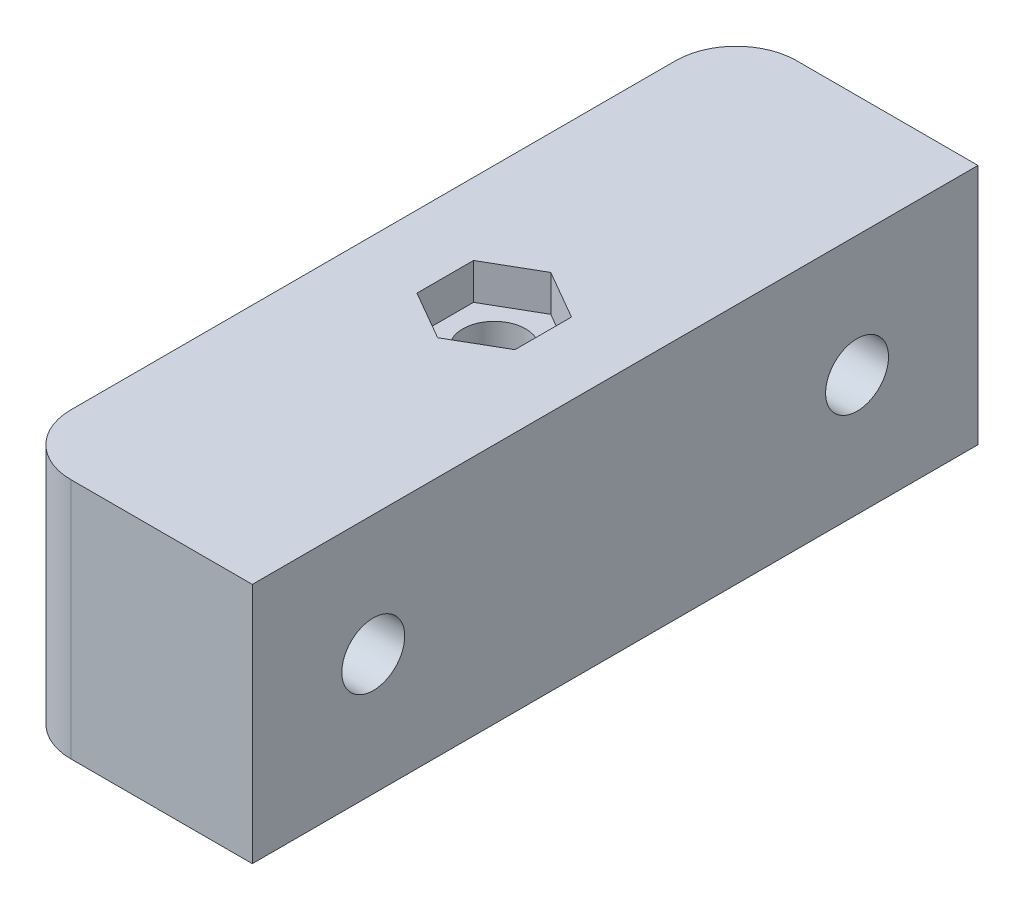
ISO-10303-21;
HEADER;
FILE_DESCRIPTION(('STEP AP214'),'2;1');
FILE_NAME('part.step','',(''),(''),'','','');
FILE_SCHEMA(('AUTOMOTIVE_DESIGN { 1 0 10303 214 1 1 1 1 }'));
ENDSEC;
DATA;
#1=APPLICATION_CONTEXT('core data for automotive mechanical design processes');
#2=APPLICATION_PROTOCOL_DEFINITION('international standard','automotive_design',2000,#1);
#3=PRODUCT_CONTEXT('',#1,'mechanical');
#4=PRODUCT('Part','Part','',(#3));
#5=PRODUCT_RELATED_PRODUCT_CATEGORY('part','',(#4));
#6=PRODUCT_DEFINITION_FORMATION('','',#4);
#7=PRODUCT_DEFINITION_CONTEXT('part definition',#1,'design');
#8=PRODUCT_DEFINITION('design','',#6,#7);
#9=PRODUCT_DEFINITION_SHAPE('','',#8);
#10=(LENGTH_UNIT() NAMED_UNIT(*) SI_UNIT(.MILLI.,.METRE.));
#11=(NAMED_UNIT(*) PLANE_ANGLE_UNIT() SI_UNIT($,.RADIAN.));
#12=(NAMED_UNIT(*) SI_UNIT($,.STERADIAN.) SOLID_ANGLE_UNIT());
#13=UNCERTAINTY_MEASURE_WITH_UNIT(LENGTH_MEASURE(1.E-05),#10,'distance_accuracy_value','');
#14=(GEOMETRIC_REPRESENTATION_CONTEXT(3) GLOBAL_UNCERTAINTY_ASSIGNED_CONTEXT((#13)) GLOBAL_UNIT_ASSIGNED_CONTEXT((#10,
#11,#12)) REPRESENTATION_CONTEXT('',''));
#15=CARTESIAN_POINT('',(0.,0.,0.));
#16=DIRECTION('',(0.,0.,1.));
#17=DIRECTION('',(1.,0.,0.));
#18=AXIS2_PLACEMENT_3D('',#15,#16,#17);
#19=CARTESIAN_POINT('',(-10.,0.,0.));
#20=DIRECTION('',(0.,1.,0.));
#21=DIRECTION('',(0.,0.,1.));
#22=AXIS2_PLACEMENT_3D('',#19,#20,#21);
#23=CYLINDRICAL_SURFACE('',#22,2.6);
#24=CARTESIAN_POINT('',(-10.,17.,0.));
#25=DIRECTION('',(0.,1.,0.));
#26=DIRECTION('',(0.,0.,1.));
#27=AXIS2_PLACEMENT_3D('',#24,#25,#26);
#28=CIRCLE('',#27,2.6);
#29=CARTESIAN_POINT('',(-10.,17.,2.6));
#30=VERTEX_POINT('',#29);
#31=EDGE_CURVE('E263',#30,#30,#28,.F.);
#32=ORIENTED_EDGE('',*,*,#31,.F.);
#33=EDGE_LOOP('',(#32));
#34=FACE_BOUND('',#33,.T.);
#35=CARTESIAN_POINT('',(-10.,8.,0.));
#36=DIRECTION('',(0.,-1.,0.));
#37=DIRECTION('',(0.,0.,-1.));
#38=AXIS2_PLACEMENT_3D('',#35,#36,#37);
#39=CIRCLE('',#38,2.6);
#40=CARTESIAN_POINT('',(-10.,8.,-2.6));
#41=VERTEX_POINT('',#40);
#42=EDGE_CURVE('E217',#41,#41,#39,.F.);
#43=ORIENTED_EDGE('',*,*,#42,.F.);
#44=EDGE_LOOP('',(#43));
#45=FACE_BOUND('',#44,.T.);
#46=ADVANCED_FACE('F33',(#34,#45),#23,.F.);
#47=CARTESIAN_POINT('',(0.,20.,0.));
#48=DIRECTION('',(-1.,0.,0.));
#49=DIRECTION('',(0.,0.,1.));
#50=AXIS2_PLACEMENT_3D('',#47,#48,#49);
#51=PLANE('',#50);
#52=CARTESIAN_POINT('',(0.,10.,-20.));
#53=DIRECTION('',(1.,0.,0.));
#54=DIRECTION('',(0.,0.,-1.));
#55=AXIS2_PLACEMENT_3D('',#52,#53,#54);
#56=CIRCLE('',#55,2.6);
#57=CARTESIAN_POINT('',(0.,10.,-22.6));
#58=VERTEX_POINT('',#57);
#59=EDGE_CURVE('E576',#58,#58,#56,.T.);
#60=ORIENTED_EDGE('',*,*,#59,.F.);
#61=EDGE_LOOP('',(#60));
#62=FACE_BOUND('',#61,.T.);
#63=CARTESIAN_POINT('',(0.,10.,20.));
#64=DIRECTION('',(1.,0.,0.));
#65=DIRECTION('',(0.,0.,-1.));
#66=AXIS2_PLACEMENT_3D('',#63,#64,#65);
#67=CIRCLE('',#66,2.6);
#68=CARTESIAN_POINT('',(0.,10.,17.4));
#69=VERTEX_POINT('',#68);
#70=EDGE_CURVE('E193',#69,#69,#67,.T.);
#71=ORIENTED_EDGE('',*,*,#70,.F.);
#72=EDGE_LOOP('',(#71));
#73=FACE_BOUND('',#72,.T.);
#74=DIRECTION('',(0.,0.,-1.));
#75=VECTOR('',#74,1.);
#76=CARTESIAN_POINT('',(0.,0.,0.));
#77=LINE('',#76,#75);
#78=CARTESIAN_POINT('',(0.,0.,30.));
#79=VERTEX_POINT('',#78);
#80=CARTESIAN_POINT('',(0.,0.,-30.));
#81=VERTEX_POINT('',#80);
#82=EDGE_CURVE('E284',#79,#81,#77,.T.);
#83=ORIENTED_EDGE('',*,*,#82,.T.);
#84=DIRECTION('',(0.,-1.,0.));
#85=VECTOR('',#84,1.);
#86=CARTESIAN_POINT('',(0.,20.,-30.));
#87=LINE('',#86,#85);
#88=CARTESIAN_POINT('',(0.,20.,-30.));
#89=VERTEX_POINT('',#88);
#90=EDGE_CURVE('E294',#89,#81,#87,.T.);
#91=ORIENTED_EDGE('',*,*,#90,.F.);
#92=DIRECTION('',(0.,0.,-1.));
#93=VECTOR('',#92,1.);
#94=CARTESIAN_POINT('',(0.,20.,30.));
#95=LINE('',#94,#93);
#96=CARTESIAN_POINT('',(0.,20.,30.));
#97=VERTEX_POINT('',#96);
#98=EDGE_CURVE('E274',#97,#89,#95,.T.);
#99=ORIENTED_EDGE('',*,*,#98,.F.);
#100=DIRECTION('',(0.,-1.,0.));
#101=VECTOR('',#100,1.);
#102=CARTESIAN_POINT('',(0.,20.,30.));
#103=LINE('',#102,#101);
#104=EDGE_CURVE('E283',#97,#79,#103,.T.);
#105=ORIENTED_EDGE('',*,*,#104,.T.);
#106=EDGE_LOOP('',(#83,#91,#99,#105));
#107=FACE_BOUND('',#106,.T.);
#108=ADVANCED_FACE('F329',(#62,#73,#107),#51,.F.);
#109=CARTESIAN_POINT('',(0.,20.,-30.));
#110=DIRECTION('',(0.,0.,1.));
#111=DIRECTION('',(1.,0.,0.));
#112=AXIS2_PLACEMENT_3D('',#109,#110,#111);
#113=PLANE('',#112);
#114=DIRECTION('',(-1.,0.,0.));
#115=VECTOR('',#114,1.);
#116=CARTESIAN_POINT('',(0.,0.,-30.));
#117=LINE('',#116,#115);
#118=CARTESIAN_POINT('',(-15.,0.,-30.));
#119=VERTEX_POINT('',#118);
#120=EDGE_CURVE('E286',#81,#119,#117,.T.);
#121=ORIENTED_EDGE('',*,*,#120,.T.);
#122=DIRECTION('',(0.,-1.,0.));
#123=VECTOR('',#122,1.);
#124=CARTESIAN_POINT('',(-15.,20.,-30.));
#125=LINE('',#124,#123);
#126=CARTESIAN_POINT('',(-15.,20.,-30.));
#127=VERTEX_POINT('',#126);
#128=EDGE_CURVE('E56',#119,#127,#125,.F.);
#129=ORIENTED_EDGE('',*,*,#128,.T.);
#130=DIRECTION('',(-1.,0.,0.));
#131=VECTOR('',#130,1.);
#132=CARTESIAN_POINT('',(0.,20.,-30.));
#133=LINE('',#132,#131);
#134=EDGE_CURVE('E276',#89,#127,#133,.T.);
#135=ORIENTED_EDGE('',*,*,#134,.F.);
#136=ORIENTED_EDGE('',*,*,#90,.T.);
#137=EDGE_LOOP('',(#121,#129,#135,#136));
#138=FACE_BOUND('',#137,.T.);
#139=ADVANCED_FACE('F325',(#138),#113,.F.);
#140=CARTESIAN_POINT('',(-20.,20.,-30.));
#141=DIRECTION('',(1.,0.,0.));
#142=DIRECTION('',(0.,0.,-1.));
#143=AXIS2_PLACEMENT_3D('',#140,#141,#142);
#144=PLANE('',#143);
#145=CARTESIAN_POINT('',(-20.,10.,-20.));
#146=DIRECTION('',(1.,0.,0.));
#147=DIRECTION('',(0.,0.,-1.));
#148=AXIS2_PLACEMENT_3D('',#145,#146,#147);
#149=CIRCLE('',#148,2.6);
#150=CARTESIAN_POINT('',(-20.,10.,-22.6));
#151=VERTEX_POINT('',#150);
#152=EDGE_CURVE('E573',#151,#151,#149,.T.);
#153=ORIENTED_EDGE('',*,*,#152,.T.);
#154=EDGE_LOOP('',(#153));
#155=FACE_BOUND('',#154,.T.);
#156=CARTESIAN_POINT('',(-20.,10.,20.));
#157=DIRECTION('',(1.,0.,0.));
#158=DIRECTION('',(0.,0.,-1.));
#159=AXIS2_PLACEMENT_3D('',#156,#157,#158);
#160=CIRCLE('',#159,2.6);
#161=CARTESIAN_POINT('',(-20.,10.,17.4));
#162=VERTEX_POINT('',#161);
#163=EDGE_CURVE('E205',#162,#162,#160,.T.);
#164=ORIENTED_EDGE('',*,*,#163,.T.);
#165=EDGE_LOOP('',(#164));
#166=FACE_BOUND('',#165,.T.);
#167=DIRECTION('',(0.,0.,1.));
#168=VECTOR('',#167,1.);
#169=CARTESIAN_POINT('',(-20.,20.,-30.));
#170=LINE('',#169,#168);
#171=CARTESIAN_POINT('',(-20.,20.,-25.));
#172=VERTEX_POINT('',#171);
#173=CARTESIAN_POINT('',(-20.,20.,25.));
#174=VERTEX_POINT('',#173);
#175=EDGE_CURVE('E279',#172,#174,#170,.T.);
#176=ORIENTED_EDGE('',*,*,#175,.F.);
#177=DIRECTION('',(0.,-1.,0.));
#178=VECTOR('',#177,1.);
#179=CARTESIAN_POINT('',(-20.,20.,-25.));
#180=LINE('',#179,#178);
#181=CARTESIAN_POINT('',(-20.,0.,-25.));
#182=VERTEX_POINT('',#181);
#183=EDGE_CURVE('E303',#172,#182,#180,.T.);
#184=ORIENTED_EDGE('',*,*,#183,.T.);
#185=DIRECTION('',(0.,0.,1.));
#186=VECTOR('',#185,1.);
#187=CARTESIAN_POINT('',(-20.,0.,-30.));
#188=LINE('',#187,#186);
#189=CARTESIAN_POINT('',(-20.,0.,25.));
#190=VERTEX_POINT('',#189);
#191=EDGE_CURVE('E288',#182,#190,#188,.T.);
#192=ORIENTED_EDGE('',*,*,#191,.T.);
#193=DIRECTION('',(0.,-1.,0.));
#194=VECTOR('',#193,1.);
#195=CARTESIAN_POINT('',(-20.,20.,25.));
#196=LINE('',#195,#194);
#197=EDGE_CURVE('E297',#190,#174,#196,.F.);
#198=ORIENTED_EDGE('',*,*,#197,.T.);
#199=EDGE_LOOP('',(#176,#184,#192,#198));
#200=FACE_BOUND('',#199,.T.);
#201=ADVANCED_FACE('F317',(#155,#166,#200),#144,.F.);
#202=CARTESIAN_POINT('',(-20.,20.,30.));
#203=DIRECTION('',(0.,0.,-1.));
#204=DIRECTION('',(-1.,0.,0.));
#205=AXIS2_PLACEMENT_3D('',#202,#203,#204);
#206=PLANE('',#205);
#207=DIRECTION('',(1.,0.,0.));
#208=VECTOR('',#207,1.);
#209=CARTESIAN_POINT('',(-20.,20.,30.));
#210=LINE('',#209,#208);
#211=CARTESIAN_POINT('',(-15.,20.,30.));
#212=VERTEX_POINT('',#211);
#213=EDGE_CURVE('E281',#212,#97,#210,.T.);
#214=ORIENTED_EDGE('',*,*,#213,.F.);
#215=DIRECTION('',(0.,-1.,0.));
#216=VECTOR('',#215,1.);
#217=CARTESIAN_POINT('',(-15.,20.,30.));
#218=LINE('',#217,#216);
#219=CARTESIAN_POINT('',(-15.,0.,30.));
#220=VERTEX_POINT('',#219);
#221=EDGE_CURVE('E11',#212,#220,#218,.T.);
#222=ORIENTED_EDGE('',*,*,#221,.T.);
#223=DIRECTION('',(1.,0.,0.));
#224=VECTOR('',#223,1.);
#225=CARTESIAN_POINT('',(-20.,0.,30.));
#226=LINE('',#225,#224);
#227=EDGE_CURVE('E277',#220,#79,#226,.T.);
#228=ORIENTED_EDGE('',*,*,#227,.T.);
#229=ORIENTED_EDGE('',*,*,#104,.F.);
#230=EDGE_LOOP('',(#214,#222,#228,#229));
#231=FACE_BOUND('',#230,.T.);
#232=ADVANCED_FACE('F333',(#231),#206,.F.);
#233=CARTESIAN_POINT('',(0.,20.,0.));
#234=DIRECTION('',(0.,1.,0.));
#235=DIRECTION('',(0.,0.,1.));
#236=AXIS2_PLACEMENT_3D('',#233,#234,#235);
#237=PLANE('',#236);
#238=DIRECTION('',(-0.866025403784439,0.,-0.5));
#239=VECTOR('',#238,1.);
#240=CARTESIAN_POINT('',(-5.95,20.,-2.33826859021798));
#241=LINE('',#240,#239);
#242=CARTESIAN_POINT('',(-5.95,20.,-2.33826859021798));
#243=VERTEX_POINT('',#242);
#244=CARTESIAN_POINT('',(-10.,20.,-4.67653718043597));
#245=VERTEX_POINT('',#244);
#246=EDGE_CURVE('E245',#243,#245,#241,.T.);
#247=ORIENTED_EDGE('',*,*,#246,.F.);
#248=DIRECTION('',(0.,0.,-1.));
#249=VECTOR('',#248,1.);
#250=CARTESIAN_POINT('',(-5.95,20.,2.33826859021799));
#251=LINE('',#250,#249);
#252=CARTESIAN_POINT('',(-5.95,20.,2.33826859021799));
#253=VERTEX_POINT('',#252);
#254=EDGE_CURVE('E229',#253,#243,#251,.T.);
#255=ORIENTED_EDGE('',*,*,#254,.F.);
#256=DIRECTION('',(0.866025403784439,0.,-0.5));
#257=VECTOR('',#256,1.);
#258=CARTESIAN_POINT('',(-9.99999999999999,20.,4.67653718043597));
#259=LINE('',#258,#257);
#260=CARTESIAN_POINT('',(-9.99999999999999,20.,4.67653718043597));
#261=VERTEX_POINT('',#260);
#262=EDGE_CURVE('E256',#261,#253,#259,.T.);
#263=ORIENTED_EDGE('',*,*,#262,.F.);
#264=DIRECTION('',(0.866025403784439,0.,0.5));
#265=VECTOR('',#264,1.);
#266=CARTESIAN_POINT('',(-14.05,20.,2.33826859021798));
#267=LINE('',#266,#265);
#268=CARTESIAN_POINT('',(-14.05,20.,2.33826859021798));
#269=VERTEX_POINT('',#268);
#270=EDGE_CURVE('E253',#269,#261,#267,.T.);
#271=ORIENTED_EDGE('',*,*,#270,.F.);
#272=DIRECTION('',(0.,0.,1.));
#273=VECTOR('',#272,1.);
#274=CARTESIAN_POINT('',(-14.05,20.,-2.33826859021799));
#275=LINE('',#274,#273);
#276=CARTESIAN_POINT('',(-14.05,20.,-2.33826859021799));
#277=VERTEX_POINT('',#276);
#278=EDGE_CURVE('E250',#277,#269,#275,.T.);
#279=ORIENTED_EDGE('',*,*,#278,.F.);
#280=DIRECTION('',(-0.866025403784439,0.,0.5));
#281=VECTOR('',#280,1.);
#282=CARTESIAN_POINT('',(-10.,20.,-4.67653718043597));
#283=LINE('',#282,#281);
#284=EDGE_CURVE('E247',#245,#277,#283,.T.);
#285=ORIENTED_EDGE('',*,*,#284,.F.);
#286=EDGE_LOOP('',(#247,#255,#263,#271,#279,#285));
#287=FACE_BOUND('',#286,.T.);
#288=ORIENTED_EDGE('',*,*,#134,.T.);
#289=CARTESIAN_POINT('',(-15.,20.,-25.));
#290=DIRECTION('',(0.,1.,0.));
#291=DIRECTION('',(0.,0.,1.));
#292=AXIS2_PLACEMENT_3D('',#289,#290,#291);
#293=CIRCLE('',#292,5.);
#294=EDGE_CURVE('E41',#127,#172,#293,.T.);
#295=ORIENTED_EDGE('',*,*,#294,.T.);
#296=ORIENTED_EDGE('',*,*,#175,.T.);
#297=CARTESIAN_POINT('',(-15.,20.,25.));
#298=DIRECTION('',(0.,1.,0.));
#299=DIRECTION('',(0.,0.,1.));
#300=AXIS2_PLACEMENT_3D('',#297,#298,#299);
#301=CIRCLE('',#300,5.);
#302=EDGE_CURVE('E48',#174,#212,#301,.T.);
#303=ORIENTED_EDGE('',*,*,#302,.T.);
#304=ORIENTED_EDGE('',*,*,#213,.T.);
#305=ORIENTED_EDGE('',*,*,#98,.T.);
#306=EDGE_LOOP('',(#288,#295,#296,#303,#304,#305));
#307=FACE_BOUND('',#306,.T.);
#308=ADVANCED_FACE('F313',(#287,#307),#237,.T.);
#309=CARTESIAN_POINT('',(0.,0.,0.));
#310=DIRECTION('',(0.,1.,0.));
#311=DIRECTION('',(0.,0.,1.));
#312=AXIS2_PLACEMENT_3D('',#309,#310,#311);
#313=PLANE('',#312);
#314=DIRECTION('',(0.866025403784438,0.,0.5));
#315=VECTOR('',#314,1.);
#316=CARTESIAN_POINT('',(-10.,0.,-4.67653718043597));
#317=LINE('',#316,#315);
#318=CARTESIAN_POINT('',(-10.,0.,-4.67653718043597));
#319=VERTEX_POINT('',#318);
#320=CARTESIAN_POINT('',(-5.95,0.,-2.33826859021798));
#321=VERTEX_POINT('',#320);
#322=EDGE_CURVE('E204',#319,#321,#317,.T.);
#323=ORIENTED_EDGE('',*,*,#322,.F.);
#324=DIRECTION('',(0.866025403784439,0.,-0.5));
#325=VECTOR('',#324,1.);
#326=CARTESIAN_POINT('',(-14.05,0.,-2.33826859021798));
#327=LINE('',#326,#325);
#328=CARTESIAN_POINT('',(-14.05,0.,-2.33826859021798));
#329=VERTEX_POINT('',#328);
#330=EDGE_CURVE('E168',#329,#319,#327,.T.);
#331=ORIENTED_EDGE('',*,*,#330,.F.);
#332=DIRECTION('',(0.,0.,-1.));
#333=VECTOR('',#332,1.);
#334=CARTESIAN_POINT('',(-14.05,0.,2.33826859021798));
#335=LINE('',#334,#333);
#336=CARTESIAN_POINT('',(-14.05,0.,2.33826859021798));
#337=VERTEX_POINT('',#336);
#338=EDGE_CURVE('E187',#337,#329,#335,.T.);
#339=ORIENTED_EDGE('',*,*,#338,.F.);
#340=DIRECTION('',(-0.866025403784438,0.,-0.5));
#341=VECTOR('',#340,1.);
#342=CARTESIAN_POINT('',(-9.99999999999999,0.,4.67653718043597));
#343=LINE('',#342,#341);
#344=CARTESIAN_POINT('',(-9.99999999999999,0.,4.67653718043597));
#345=VERTEX_POINT('',#344);
#346=EDGE_CURVE('E190',#345,#337,#343,.T.);
#347=ORIENTED_EDGE('',*,*,#346,.F.);
#348=DIRECTION('',(-0.866025403784438,0.,0.5));
#349=VECTOR('',#348,1.);
#350=CARTESIAN_POINT('',(-5.95,0.,2.33826859021798));
#351=LINE('',#350,#349);
#352=CARTESIAN_POINT('',(-5.95,0.,2.33826859021798));
#353=VERTEX_POINT('',#352);
#354=EDGE_CURVE('E210',#353,#345,#351,.T.);
#355=ORIENTED_EDGE('',*,*,#354,.F.);
#356=DIRECTION('',(0.,0.,1.));
#357=VECTOR('',#356,1.);
#358=CARTESIAN_POINT('',(-5.95,0.,-2.33826859021798));
#359=LINE('',#358,#357);
#360=EDGE_CURVE('E207',#321,#353,#359,.T.);
#361=ORIENTED_EDGE('',*,*,#360,.F.);
#362=EDGE_LOOP('',(#323,#331,#339,#347,#355,#361));
#363=FACE_BOUND('',#362,.T.);
#364=ORIENTED_EDGE('',*,*,#191,.F.);
#365=CARTESIAN_POINT('',(-15.,0.,-25.));
#366=DIRECTION('',(0.,1.,0.));
#367=DIRECTION('',(0.,0.,1.));
#368=AXIS2_PLACEMENT_3D('',#365,#366,#367);
#369=CIRCLE('',#368,5.);
#370=EDGE_CURVE('E308',#182,#119,#369,.F.);
#371=ORIENTED_EDGE('',*,*,#370,.T.);
#372=ORIENTED_EDGE('',*,*,#120,.F.);
#373=ORIENTED_EDGE('',*,*,#82,.F.);
#374=ORIENTED_EDGE('',*,*,#227,.F.);
#375=CARTESIAN_POINT('',(-15.,0.,25.));
#376=DIRECTION('',(0.,1.,0.));
#377=DIRECTION('',(0.,0.,1.));
#378=AXIS2_PLACEMENT_3D('',#375,#376,#377);
#379=CIRCLE('',#378,5.);
#380=EDGE_CURVE('E306',#220,#190,#379,.F.);
#381=ORIENTED_EDGE('',*,*,#380,.T.);
#382=EDGE_LOOP('',(#364,#371,#372,#373,#374,#381));
#383=FACE_BOUND('',#382,.T.);
#384=ADVANCED_FACE('F323',(#363,#383),#313,.F.);
#385=CARTESIAN_POINT('',(0.,17.,0.));
#386=DIRECTION('',(0.,1.,0.));
#387=DIRECTION('',(0.,0.,1.));
#388=AXIS2_PLACEMENT_3D('',#385,#386,#387);
#389=PLANE('',#388);
#390=DIRECTION('',(-0.866025403784439,0.,-0.5));
#391=VECTOR('',#390,1.);
#392=CARTESIAN_POINT('',(-5.95,17.,-2.33826859021798));
#393=LINE('',#392,#391);
#394=CARTESIAN_POINT('',(-5.95,17.,-2.33826859021798));
#395=VERTEX_POINT('',#394);
#396=CARTESIAN_POINT('',(-10.,17.,-4.67653718043597));
#397=VERTEX_POINT('',#396);
#398=EDGE_CURVE('E225',#395,#397,#393,.T.);
#399=ORIENTED_EDGE('',*,*,#398,.T.);
#400=DIRECTION('',(-0.866025403784439,0.,0.5));
#401=VECTOR('',#400,1.);
#402=CARTESIAN_POINT('',(-10.,17.,-4.67653718043597));
#403=LINE('',#402,#401);
#404=CARTESIAN_POINT('',(-14.05,17.,-2.33826859021799));
#405=VERTEX_POINT('',#404);
#406=EDGE_CURVE('E228',#397,#405,#403,.T.);
#407=ORIENTED_EDGE('',*,*,#406,.T.);
#408=DIRECTION('',(0.,0.,1.));
#409=VECTOR('',#408,1.);
#410=CARTESIAN_POINT('',(-14.05,17.,-2.33826859021799));
#411=LINE('',#410,#409);
#412=CARTESIAN_POINT('',(-14.05,17.,2.33826859021798));
#413=VERTEX_POINT('',#412);
#414=EDGE_CURVE('E232',#405,#413,#411,.T.);
#415=ORIENTED_EDGE('',*,*,#414,.T.);
#416=DIRECTION('',(0.866025403784439,0.,0.5));
#417=VECTOR('',#416,1.);
#418=CARTESIAN_POINT('',(-14.05,17.,2.33826859021798));
#419=LINE('',#418,#417);
#420=CARTESIAN_POINT('',(-9.99999999999999,17.,4.67653718043597));
#421=VERTEX_POINT('',#420);
#422=EDGE_CURVE('E235',#413,#421,#419,.T.);
#423=ORIENTED_EDGE('',*,*,#422,.T.);
#424=DIRECTION('',(0.866025403784439,0.,-0.5));
#425=VECTOR('',#424,1.);
#426=CARTESIAN_POINT('',(-9.99999999999999,17.,4.67653718043597));
#427=LINE('',#426,#425);
#428=CARTESIAN_POINT('',(-5.95,17.,2.33826859021799));
#429=VERTEX_POINT('',#428);
#430=EDGE_CURVE('E238',#421,#429,#427,.T.);
#431=ORIENTED_EDGE('',*,*,#430,.T.);
#432=DIRECTION('',(0.,0.,-1.));
#433=VECTOR('',#432,1.);
#434=CARTESIAN_POINT('',(-5.95,17.,2.33826859021799));
#435=LINE('',#434,#433);
#436=EDGE_CURVE('E241',#429,#395,#435,.T.);
#437=ORIENTED_EDGE('',*,*,#436,.T.);
#438=EDGE_LOOP('',(#399,#407,#415,#423,#431,#437));
#439=FACE_BOUND('',#438,.T.);
#440=ORIENTED_EDGE('',*,*,#31,.T.);
#441=EDGE_LOOP('',(#440));
#442=FACE_BOUND('',#441,.T.);
#443=ADVANCED_FACE('F360',(#439,#442),#389,.T.);
#444=CARTESIAN_POINT('',(-5.95,17.,-2.33826859021798));
#445=DIRECTION('',(0.5,0.,-0.866025403784438));
#446=DIRECTION('',(-0.866025403784439,0.,-0.5));
#447=AXIS2_PLACEMENT_3D('',#444,#445,#446);
#448=PLANE('',#447);
#449=ORIENTED_EDGE('',*,*,#246,.T.);
#450=DIRECTION('',(0.,1.,0.));
#451=VECTOR('',#450,1.);
#452=CARTESIAN_POINT('',(-10.,17.,-4.67653718043597));
#453=LINE('',#452,#451);
#454=EDGE_CURVE('E244',#397,#245,#453,.T.);
#455=ORIENTED_EDGE('',*,*,#454,.F.);
#456=ORIENTED_EDGE('',*,*,#398,.F.);
#457=DIRECTION('',(0.,1.,0.));
#458=VECTOR('',#457,1.);
#459=CARTESIAN_POINT('',(-5.95,17.,-2.33826859021798));
#460=LINE('',#459,#458);
#461=EDGE_CURVE('E261',#395,#243,#460,.T.);
#462=ORIENTED_EDGE('',*,*,#461,.T.);
#463=EDGE_LOOP('',(#449,#455,#456,#462));
#464=FACE_BOUND('',#463,.T.);
#465=ADVANCED_FACE('F353',(#464),#448,.F.);
#466=CARTESIAN_POINT('',(-5.95,17.,2.33826859021799));
#467=DIRECTION('',(1.,0.,0.));
#468=DIRECTION('',(0.,0.,-1.));
#469=AXIS2_PLACEMENT_3D('',#466,#467,#468);
#470=PLANE('',#469);
#471=ORIENTED_EDGE('',*,*,#254,.T.);
#472=ORIENTED_EDGE('',*,*,#461,.F.);
#473=ORIENTED_EDGE('',*,*,#436,.F.);
#474=DIRECTION('',(0.,1.,0.));
#475=VECTOR('',#474,1.);
#476=CARTESIAN_POINT('',(-5.95,17.,2.33826859021799));
#477=LINE('',#476,#475);
#478=EDGE_CURVE('E264',#429,#253,#477,.T.);
#479=ORIENTED_EDGE('',*,*,#478,.T.);
#480=EDGE_LOOP('',(#471,#472,#473,#479));
#481=FACE_BOUND('',#480,.T.);
#482=ADVANCED_FACE('F403',(#481),#470,.F.);
#483=CARTESIAN_POINT('',(-9.99999999999999,17.,4.67653718043597));
#484=DIRECTION('',(0.5,0.,0.866025403784439));
#485=DIRECTION('',(0.866025403784439,0.,-0.5));
#486=AXIS2_PLACEMENT_3D('',#483,#484,#485);
#487=PLANE('',#486);
#488=ORIENTED_EDGE('',*,*,#262,.T.);
#489=ORIENTED_EDGE('',*,*,#478,.F.);
#490=ORIENTED_EDGE('',*,*,#430,.F.);
#491=DIRECTION('',(0.,1.,0.));
#492=VECTOR('',#491,1.);
#493=CARTESIAN_POINT('',(-9.99999999999999,17.,4.67653718043597));
#494=LINE('',#493,#492);
#495=EDGE_CURVE('E266',#421,#261,#494,.T.);
#496=ORIENTED_EDGE('',*,*,#495,.T.);
#497=EDGE_LOOP('',(#488,#489,#490,#496));
#498=FACE_BOUND('',#497,.T.);
#499=ADVANCED_FACE('F410',(#498),#487,.F.);
#500=CARTESIAN_POINT('',(-14.05,17.,2.33826859021798));
#501=DIRECTION('',(-0.5,0.,0.866025403784439));
#502=DIRECTION('',(0.866025403784439,0.,0.5));
#503=AXIS2_PLACEMENT_3D('',#500,#501,#502);
#504=PLANE('',#503);
#505=ORIENTED_EDGE('',*,*,#270,.T.);
#506=ORIENTED_EDGE('',*,*,#495,.F.);
#507=ORIENTED_EDGE('',*,*,#422,.F.);
#508=DIRECTION('',(0.,1.,0.));
#509=VECTOR('',#508,1.);
#510=CARTESIAN_POINT('',(-14.05,17.,2.33826859021798));
#511=LINE('',#510,#509);
#512=EDGE_CURVE('E268',#413,#269,#511,.T.);
#513=ORIENTED_EDGE('',*,*,#512,.T.);
#514=EDGE_LOOP('',(#505,#506,#507,#513));
#515=FACE_BOUND('',#514,.T.);
#516=ADVANCED_FACE('F418',(#515),#504,.F.);
#517=CARTESIAN_POINT('',(-14.05,17.,-2.33826859021799));
#518=DIRECTION('',(-1.,0.,0.));
#519=DIRECTION('',(0.,0.,1.));
#520=AXIS2_PLACEMENT_3D('',#517,#518,#519);
#521=PLANE('',#520);
#522=ORIENTED_EDGE('',*,*,#278,.T.);
#523=ORIENTED_EDGE('',*,*,#512,.F.);
#524=ORIENTED_EDGE('',*,*,#414,.F.);
#525=DIRECTION('',(0.,1.,0.));
#526=VECTOR('',#525,1.);
#527=CARTESIAN_POINT('',(-14.05,17.,-2.33826859021799));
#528=LINE('',#527,#526);
#529=EDGE_CURVE('E270',#405,#277,#528,.T.);
#530=ORIENTED_EDGE('',*,*,#529,.T.);
#531=EDGE_LOOP('',(#522,#523,#524,#530));
#532=FACE_BOUND('',#531,.T.);
#533=ADVANCED_FACE('F426',(#532),#521,.F.);
#534=CARTESIAN_POINT('',(-10.,17.,-4.67653718043597));
#535=DIRECTION('',(-0.5,0.,-0.866025403784439));
#536=DIRECTION('',(-0.866025403784439,0.,0.5));
#537=AXIS2_PLACEMENT_3D('',#534,#535,#536);
#538=PLANE('',#537);
#539=ORIENTED_EDGE('',*,*,#284,.T.);
#540=ORIENTED_EDGE('',*,*,#529,.F.);
#541=ORIENTED_EDGE('',*,*,#406,.F.);
#542=ORIENTED_EDGE('',*,*,#454,.T.);
#543=EDGE_LOOP('',(#539,#540,#541,#542));
#544=FACE_BOUND('',#543,.T.);
#545=ADVANCED_FACE('F434',(#544),#538,.F.);
#546=CARTESIAN_POINT('',(0.,8.,0.));
#547=DIRECTION('',(0.,-1.,0.));
#548=DIRECTION('',(0.,0.,-1.));
#549=AXIS2_PLACEMENT_3D('',#546,#547,#548);
#550=PLANE('',#549);
#551=DIRECTION('',(0.866025403784439,0.,-0.5));
#552=VECTOR('',#551,1.);
#553=CARTESIAN_POINT('',(-14.05,8.,-2.33826859021798));
#554=LINE('',#553,#552);
#555=CARTESIAN_POINT('',(-14.05,8.,-2.33826859021798));
#556=VERTEX_POINT('',#555);
#557=CARTESIAN_POINT('',(-10.,8.,-4.67653718043597));
#558=VERTEX_POINT('',#557);
#559=EDGE_CURVE('E165',#556,#558,#554,.T.);
#560=ORIENTED_EDGE('',*,*,#559,.T.);
#561=DIRECTION('',(0.866025403784438,0.,0.5));
#562=VECTOR('',#561,1.);
#563=CARTESIAN_POINT('',(-10.,8.,-4.67653718043597));
#564=LINE('',#563,#562);
#565=CARTESIAN_POINT('',(-5.95,8.,-2.33826859021798));
#566=VERTEX_POINT('',#565);
#567=EDGE_CURVE('E176',#558,#566,#564,.T.);
#568=ORIENTED_EDGE('',*,*,#567,.T.);
#569=DIRECTION('',(0.,0.,1.));
#570=VECTOR('',#569,1.);
#571=CARTESIAN_POINT('',(-5.95,8.,-2.33826859021798));
#572=LINE('',#571,#570);
#573=CARTESIAN_POINT('',(-5.95,8.,2.33826859021798));
#574=VERTEX_POINT('',#573);
#575=EDGE_CURVE('E181',#566,#574,#572,.T.);
#576=ORIENTED_EDGE('',*,*,#575,.T.);
#577=DIRECTION('',(-0.866025403784438,0.,0.5));
#578=VECTOR('',#577,1.);
#579=CARTESIAN_POINT('',(-5.95,8.,2.33826859021798));
#580=LINE('',#579,#578);
#581=CARTESIAN_POINT('',(-9.99999999999999,8.,4.67653718043597));
#582=VERTEX_POINT('',#581);
#583=EDGE_CURVE('E197',#574,#582,#580,.T.);
#584=ORIENTED_EDGE('',*,*,#583,.T.);
#585=DIRECTION('',(-0.866025403784438,0.,-0.5));
#586=VECTOR('',#585,1.);
#587=CARTESIAN_POINT('',(-9.99999999999999,8.,4.67653718043597));
#588=LINE('',#587,#586);
#589=CARTESIAN_POINT('',(-14.05,8.,2.33826859021798));
#590=VERTEX_POINT('',#589);
#591=EDGE_CURVE('E200',#582,#590,#588,.T.);
#592=ORIENTED_EDGE('',*,*,#591,.T.);
#593=DIRECTION('',(0.,0.,-1.));
#594=VECTOR('',#593,1.);
#595=CARTESIAN_POINT('',(-14.05,8.,2.33826859021798));
#596=LINE('',#595,#594);
#597=EDGE_CURVE('E173',#590,#556,#596,.T.);
#598=ORIENTED_EDGE('',*,*,#597,.T.);
#599=EDGE_LOOP('',(#560,#568,#576,#584,#592,#598));
#600=FACE_BOUND('',#599,.T.);
#601=ORIENTED_EDGE('',*,*,#42,.T.);
#602=EDGE_LOOP('',(#601));
#603=FACE_BOUND('',#602,.T.);
#604=ADVANCED_FACE('F183',(#600,#603),#550,.T.);
#605=CARTESIAN_POINT('',(-14.05,8.,-2.33826859021798));
#606=DIRECTION('',(-0.5,0.,-0.866025403784439));
#607=DIRECTION('',(-0.866025403784439,0.,0.5));
#608=AXIS2_PLACEMENT_3D('',#605,#606,#607);
#609=PLANE('',#608);
#610=ORIENTED_EDGE('',*,*,#330,.T.);
#611=DIRECTION('',(0.,-1.,0.));
#612=VECTOR('',#611,1.);
#613=CARTESIAN_POINT('',(-10.,8.,-4.67653718043597));
#614=LINE('',#613,#612);
#615=EDGE_CURVE('E161',#558,#319,#614,.T.);
#616=ORIENTED_EDGE('',*,*,#615,.F.);
#617=ORIENTED_EDGE('',*,*,#559,.F.);
#618=DIRECTION('',(0.,-1.,0.));
#619=VECTOR('',#618,1.);
#620=CARTESIAN_POINT('',(-14.05,8.,-2.33826859021798));
#621=LINE('',#620,#619);
#622=EDGE_CURVE('E215',#556,#329,#621,.T.);
#623=ORIENTED_EDGE('',*,*,#622,.T.);
#624=EDGE_LOOP('',(#610,#616,#617,#623));
#625=FACE_BOUND('',#624,.T.);
#626=ADVANCED_FACE('F163',(#625),#609,.F.);
#627=CARTESIAN_POINT('',(-14.05,8.,2.33826859021798));
#628=DIRECTION('',(-1.,0.,0.));
#629=DIRECTION('',(0.,0.,1.));
#630=AXIS2_PLACEMENT_3D('',#627,#628,#629);
#631=PLANE('',#630);
#632=ORIENTED_EDGE('',*,*,#338,.T.);
#633=ORIENTED_EDGE('',*,*,#622,.F.);
#634=ORIENTED_EDGE('',*,*,#597,.F.);
#635=DIRECTION('',(0.,-1.,0.));
#636=VECTOR('',#635,1.);
#637=CARTESIAN_POINT('',(-14.05,8.,2.33826859021798));
#638=LINE('',#637,#636);
#639=EDGE_CURVE('E218',#590,#337,#638,.T.);
#640=ORIENTED_EDGE('',*,*,#639,.T.);
#641=EDGE_LOOP('',(#632,#633,#634,#640));
#642=FACE_BOUND('',#641,.T.);
#643=ADVANCED_FACE('F454',(#642),#631,.F.);
#644=CARTESIAN_POINT('',(-9.99999999999999,8.,4.67653718043597));
#645=DIRECTION('',(-0.5,0.,0.866025403784438));
#646=DIRECTION('',(0.866025403784438,0.,0.5));
#647=AXIS2_PLACEMENT_3D('',#644,#645,#646);
#648=PLANE('',#647);
#649=ORIENTED_EDGE('',*,*,#346,.T.);
#650=ORIENTED_EDGE('',*,*,#639,.F.);
#651=ORIENTED_EDGE('',*,*,#591,.F.);
#652=DIRECTION('',(0.,-1.,0.));
#653=VECTOR('',#652,1.);
#654=CARTESIAN_POINT('',(-9.99999999999999,8.,4.67653718043597));
#655=LINE('',#654,#653);
#656=EDGE_CURVE('E220',#582,#345,#655,.T.);
#657=ORIENTED_EDGE('',*,*,#656,.T.);
#658=EDGE_LOOP('',(#649,#650,#651,#657));
#659=FACE_BOUND('',#658,.T.);
#660=ADVANCED_FACE('F461',(#659),#648,.F.);
#661=CARTESIAN_POINT('',(-5.95,8.,2.33826859021798));
#662=DIRECTION('',(0.5,0.,0.866025403784439));
#663=DIRECTION('',(0.866025403784438,0.,-0.5));
#664=AXIS2_PLACEMENT_3D('',#661,#662,#663);
#665=PLANE('',#664);
#666=ORIENTED_EDGE('',*,*,#354,.T.);
#667=ORIENTED_EDGE('',*,*,#656,.F.);
#668=ORIENTED_EDGE('',*,*,#583,.F.);
#669=DIRECTION('',(0.,-1.,0.));
#670=VECTOR('',#669,1.);
#671=CARTESIAN_POINT('',(-5.95,8.,2.33826859021798));
#672=LINE('',#671,#670);
#673=EDGE_CURVE('E222',#574,#353,#672,.T.);
#674=ORIENTED_EDGE('',*,*,#673,.T.);
#675=EDGE_LOOP('',(#666,#667,#668,#674));
#676=FACE_BOUND('',#675,.T.);
#677=ADVANCED_FACE('F469',(#676),#665,.F.);
#678=CARTESIAN_POINT('',(-5.95,8.,-2.33826859021798));
#679=DIRECTION('',(1.,0.,0.));
#680=DIRECTION('',(0.,0.,-1.));
#681=AXIS2_PLACEMENT_3D('',#678,#679,#680);
#682=PLANE('',#681);
#683=ORIENTED_EDGE('',*,*,#360,.T.);
#684=ORIENTED_EDGE('',*,*,#673,.F.);
#685=ORIENTED_EDGE('',*,*,#575,.F.);
#686=DIRECTION('',(0.,-1.,0.));
#687=VECTOR('',#686,1.);
#688=CARTESIAN_POINT('',(-5.95,8.,-2.33826859021798));
#689=LINE('',#688,#687);
#690=EDGE_CURVE('E172',#566,#321,#689,.T.);
#691=ORIENTED_EDGE('',*,*,#690,.T.);
#692=EDGE_LOOP('',(#683,#684,#685,#691));
#693=FACE_BOUND('',#692,.T.);
#694=ADVANCED_FACE('F477',(#693),#682,.F.);
#695=CARTESIAN_POINT('',(-10.,8.,-4.67653718043597));
#696=DIRECTION('',(0.5,0.,-0.866025403784438));
#697=DIRECTION('',(-0.866025403784439,0.,-0.5));
#698=AXIS2_PLACEMENT_3D('',#695,#696,#697);
#699=PLANE('',#698);
#700=ORIENTED_EDGE('',*,*,#322,.T.);
#701=ORIENTED_EDGE('',*,*,#690,.F.);
#702=ORIENTED_EDGE('',*,*,#567,.F.);
#703=ORIENTED_EDGE('',*,*,#615,.T.);
#704=EDGE_LOOP('',(#700,#701,#702,#703));
#705=FACE_BOUND('',#704,.T.);
#706=ADVANCED_FACE('F177',(#705),#699,.F.);
#707=CARTESIAN_POINT('',(-20.,10.,20.));
#708=DIRECTION('',(1.,0.,0.));
#709=DIRECTION('',(0.,0.,-1.));
#710=AXIS2_PLACEMENT_3D('',#707,#708,#709);
#711=CYLINDRICAL_SURFACE('',#710,2.6);
#712=ORIENTED_EDGE('',*,*,#163,.F.);
#713=EDGE_LOOP('',(#712));
#714=FACE_BOUND('',#713,.T.);
#715=ORIENTED_EDGE('',*,*,#70,.T.);
#716=EDGE_LOOP('',(#715));
#717=FACE_BOUND('',#716,.T.);
#718=ADVANCED_FACE('F492',(#714,#717),#711,.F.);
#719=CARTESIAN_POINT('',(-20.,10.,-20.));
#720=DIRECTION('',(1.,0.,0.));
#721=DIRECTION('',(0.,0.,-1.));
#722=AXIS2_PLACEMENT_3D('',#719,#720,#721);
#723=CYLINDRICAL_SURFACE('',#722,2.6);
#724=ORIENTED_EDGE('',*,*,#152,.F.);
#725=EDGE_LOOP('',(#724));
#726=FACE_BOUND('',#725,.T.);
#727=ORIENTED_EDGE('',*,*,#59,.T.);
#728=EDGE_LOOP('',(#727));
#729=FACE_BOUND('',#728,.T.);
#730=ADVANCED_FACE('F340',(#726,#729),#723,.F.);
#731=CARTESIAN_POINT('',(-15.,20.,-25.));
#732=DIRECTION('',(0.,-1.,0.));
#733=DIRECTION('',(0.,0.,-1.));
#734=AXIS2_PLACEMENT_3D('',#731,#732,#733);
#735=CYLINDRICAL_SURFACE('',#734,5.);
#736=ORIENTED_EDGE('',*,*,#294,.F.);
#737=ORIENTED_EDGE('',*,*,#128,.F.);
#738=ORIENTED_EDGE('',*,*,#370,.F.);
#739=ORIENTED_EDGE('',*,*,#183,.F.);
#740=EDGE_LOOP('',(#736,#737,#738,#739));
#741=FACE_BOUND('',#740,.T.);
#742=ADVANCED_FACE('F320',(#741),#735,.T.);
#743=CARTESIAN_POINT('',(-15.,20.,25.));
#744=DIRECTION('',(0.,-1.,0.));
#745=DIRECTION('',(0.,0.,-1.));
#746=AXIS2_PLACEMENT_3D('',#743,#744,#745);
#747=CYLINDRICAL_SURFACE('',#746,5.);
#748=ORIENTED_EDGE('',*,*,#302,.F.);
#749=ORIENTED_EDGE('',*,*,#197,.F.);
#750=ORIENTED_EDGE('',*,*,#380,.F.);
#751=ORIENTED_EDGE('',*,*,#221,.F.);
#752=EDGE_LOOP('',(#748,#749,#750,#751));
#753=FACE_BOUND('',#752,.T.);
#754=ADVANCED_FACE('F35',(#753),#747,.T.);
#755=CLOSED_SHELL('',(#46,#108,#139,#201,#232,#308,#384,#443,#465,#482,#499,#516,#533,#545,#604,
#626,#643,#660,#677,#694,#706,#718,#730,#742,#754));
#756=MANIFOLD_SOLID_BREP('B2',#755);
#757=ADVANCED_BREP_SHAPE_REPRESENTATION('',(#18,#756),#14);
#758=SHAPE_DEFINITION_REPRESENTATION(#9,#757);
ENDSEC;
END-ISO-10303-21;
